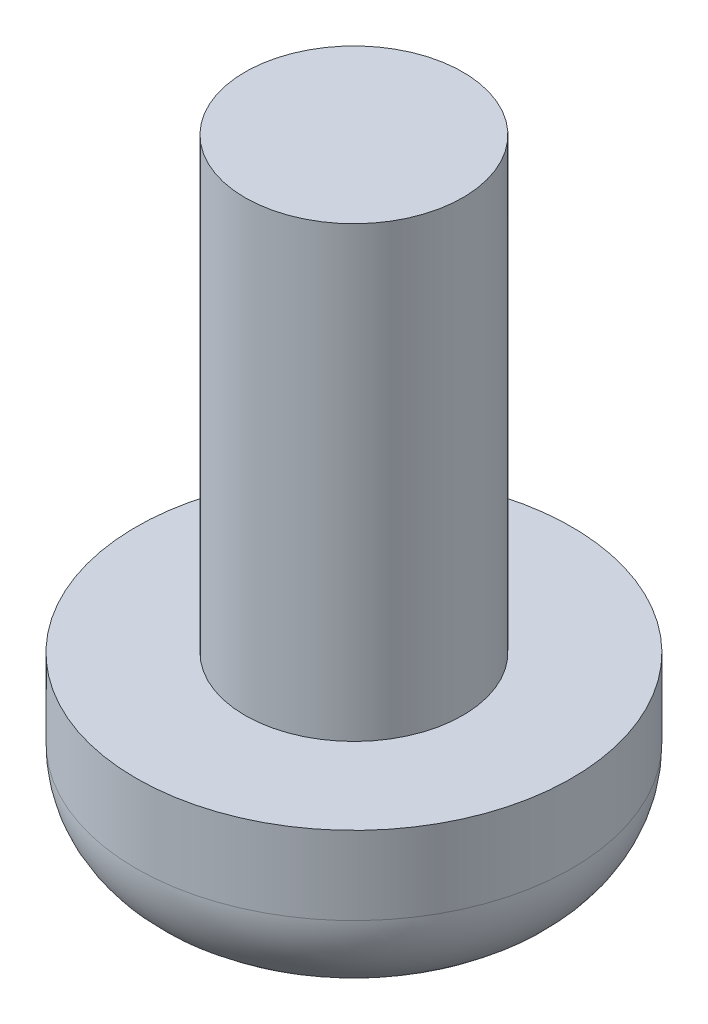
ISO-10303-21;
HEADER;
FILE_DESCRIPTION(('STEP AP214'),'2;1');
FILE_NAME('part.step','',(''),(''),'','','');
FILE_SCHEMA(('AUTOMOTIVE_DESIGN { 1 0 10303 214 1 1 1 1 }'));
ENDSEC;
DATA;
#1=APPLICATION_CONTEXT('core data for automotive mechanical design processes');
#2=APPLICATION_PROTOCOL_DEFINITION('international standard','automotive_design',2000,#1);
#3=PRODUCT_CONTEXT('',#1,'mechanical');
#4=PRODUCT('Part','Part','',(#3));
#5=PRODUCT_RELATED_PRODUCT_CATEGORY('part','',(#4));
#6=PRODUCT_DEFINITION_FORMATION('','',#4);
#7=PRODUCT_DEFINITION_CONTEXT('part definition',#1,'design');
#8=PRODUCT_DEFINITION('design','',#6,#7);
#9=PRODUCT_DEFINITION_SHAPE('','',#8);
#10=(LENGTH_UNIT() NAMED_UNIT(*) SI_UNIT(.MILLI.,.METRE.));
#11=(NAMED_UNIT(*) PLANE_ANGLE_UNIT() SI_UNIT($,.RADIAN.));
#12=(NAMED_UNIT(*) SI_UNIT($,.STERADIAN.) SOLID_ANGLE_UNIT());
#13=UNCERTAINTY_MEASURE_WITH_UNIT(LENGTH_MEASURE(1.E-05),#10,'distance_accuracy_value','');
#14=(GEOMETRIC_REPRESENTATION_CONTEXT(3) GLOBAL_UNCERTAINTY_ASSIGNED_CONTEXT((#13)) GLOBAL_UNIT_ASSIGNED_CONTEXT((#10,
#11,#12)) REPRESENTATION_CONTEXT('',''));
#15=CARTESIAN_POINT('',(0.,0.,0.));
#16=DIRECTION('',(0.,0.,1.));
#17=DIRECTION('',(1.,0.,0.));
#18=AXIS2_PLACEMENT_3D('',#15,#16,#17);
#19=CARTESIAN_POINT('',(38.,4.5,17.));
#20=DIRECTION('',(0.,1.,0.));
#21=DIRECTION('',(0.,0.,1.));
#22=AXIS2_PLACEMENT_3D('',#19,#20,#21);
#23=PLANE('',#22);
#24=CARTESIAN_POINT('',(38.,4.5,17.));
#25=DIRECTION('',(0.,1.,0.));
#26=DIRECTION('',(0.,0.,1.));
#27=AXIS2_PLACEMENT_3D('',#24,#25,#26);
#28=CIRCLE('',#27,1.7);
#29=CARTESIAN_POINT('',(38.,4.50000000000001,18.7));
#30=VERTEX_POINT('',#29);
#31=EDGE_CURVE('E10',#30,#30,#28,.T.);
#32=ORIENTED_EDGE('',*,*,#31,.T.);
#33=EDGE_LOOP('',(#32));
#34=FACE_BOUND('',#33,.T.);
#35=ADVANCED_FACE('F14',(#34),#23,.T.);
#36=CARTESIAN_POINT('',(38.,-5.22,17.));
#37=DIRECTION('',(0.,1.,0.));
#38=DIRECTION('',(0.,0.,1.));
#39=AXIS2_PLACEMENT_3D('',#36,#37,#38);
#40=CYLINDRICAL_SURFACE('',#39,1.7);
#41=CARTESIAN_POINT('',(38.,-2.5,17.));
#42=DIRECTION('',(0.,1.,0.));
#43=DIRECTION('',(0.,0.,1.));
#44=AXIS2_PLACEMENT_3D('',#41,#42,#43);
#45=CIRCLE('',#44,1.7);
#46=CARTESIAN_POINT('',(38.,-2.49999999999999,18.7));
#47=VERTEX_POINT('',#46);
#48=EDGE_CURVE('E21',#47,#47,#45,.T.);
#49=ORIENTED_EDGE('',*,*,#48,.T.);
#50=EDGE_LOOP('',(#49));
#51=FACE_BOUND('',#50,.T.);
#52=ORIENTED_EDGE('',*,*,#31,.F.);
#53=EDGE_LOOP('',(#52));
#54=FACE_BOUND('',#53,.T.);
#55=ADVANCED_FACE('F60',(#51,#54),#40,.T.);
#56=CARTESIAN_POINT('',(39.7,-2.5,17.));
#57=DIRECTION('',(0.,1.,0.));
#58=DIRECTION('',(0.,0.,1.));
#59=AXIS2_PLACEMENT_3D('',#56,#57,#58);
#60=PLANE('',#59);
#61=CARTESIAN_POINT('',(38.,-2.5,17.));
#62=DIRECTION('',(0.,1.,0.));
#63=DIRECTION('',(0.,0.,1.));
#64=AXIS2_PLACEMENT_3D('',#61,#62,#63);
#65=CIRCLE('',#64,3.4);
#66=CARTESIAN_POINT('',(38.,-2.49999999999998,20.4));
#67=VERTEX_POINT('',#66);
#68=EDGE_CURVE('E30',#67,#67,#65,.T.);
#69=ORIENTED_EDGE('',*,*,#68,.T.);
#70=EDGE_LOOP('',(#69));
#71=FACE_BOUND('',#70,.T.);
#72=ORIENTED_EDGE('',*,*,#48,.F.);
#73=EDGE_LOOP('',(#72));
#74=FACE_BOUND('',#73,.T.);
#75=ADVANCED_FACE('F64',(#71,#74),#60,.T.);
#76=CARTESIAN_POINT('',(38.,-5.22,17.));
#77=DIRECTION('',(0.,1.,0.));
#78=DIRECTION('',(0.,0.,1.));
#79=AXIS2_PLACEMENT_3D('',#76,#77,#78);
#80=CYLINDRICAL_SURFACE('',#79,3.4);
#81=CARTESIAN_POINT('',(38.,-3.72,17.));
#82=DIRECTION('',(0.,1.,0.));
#83=DIRECTION('',(0.,0.,1.));
#84=AXIS2_PLACEMENT_3D('',#81,#82,#83);
#85=CIRCLE('',#84,3.4);
#86=CARTESIAN_POINT('',(38.,-3.71999999999998,20.4));
#87=VERTEX_POINT('',#86);
#88=EDGE_CURVE('E37',#87,#87,#85,.T.);
#89=ORIENTED_EDGE('',*,*,#88,.T.);
#90=EDGE_LOOP('',(#89));
#91=FACE_BOUND('',#90,.T.);
#92=ORIENTED_EDGE('',*,*,#68,.F.);
#93=EDGE_LOOP('',(#92));
#94=FACE_BOUND('',#93,.T.);
#95=ADVANCED_FACE('F57',(#91,#94),#80,.T.);
#96=CARTESIAN_POINT('',(38.,-3.7200000000001,17.));
#97=DIRECTION('',(0.,1.,0.));
#98=DIRECTION('',(0.,0.,1.));
#99=AXIS2_PLACEMENT_3D('',#96,#97,#98);
#100=TOROIDAL_SURFACE('',#99,1.9,1.5);
#101=CARTESIAN_POINT('',(38.,-5.2200000000001,17.));
#102=DIRECTION('',(0.,1.,0.));
#103=DIRECTION('',(0.,0.,1.));
#104=AXIS2_PLACEMENT_3D('',#101,#102,#103);
#105=CIRCLE('',#104,1.9);
#106=CARTESIAN_POINT('',(38.,-5.22000000000009,18.9));
#107=VERTEX_POINT('',#106);
#108=EDGE_CURVE('E42',#107,#107,#105,.T.);
#109=ORIENTED_EDGE('',*,*,#108,.T.);
#110=EDGE_LOOP('',(#109));
#111=FACE_BOUND('',#110,.T.);
#112=ORIENTED_EDGE('',*,*,#88,.F.);
#113=EDGE_LOOP('',(#112));
#114=FACE_BOUND('',#113,.T.);
#115=ADVANCED_FACE('F47',(#111,#114),#100,.T.);
#116=CARTESIAN_POINT('',(39.9,-5.22,17.));
#117=DIRECTION('',(0.,-1.,0.));
#118=DIRECTION('',(0.,0.,-1.));
#119=AXIS2_PLACEMENT_3D('',#116,#117,#118);
#120=PLANE('',#119);
#121=ORIENTED_EDGE('',*,*,#108,.F.);
#122=EDGE_LOOP('',(#121));
#123=FACE_BOUND('',#122,.T.);
#124=ADVANCED_FACE('F50',(#123),#120,.T.);
#125=CLOSED_SHELL('',(#35,#55,#75,#95,#115,#124));
#126=MANIFOLD_SOLID_BREP('B1',#125);
#127=ADVANCED_BREP_SHAPE_REPRESENTATION('',(#18,#126),#14);
#128=SHAPE_DEFINITION_REPRESENTATION(#9,#127);
ENDSEC;
END-ISO-10303-21;
